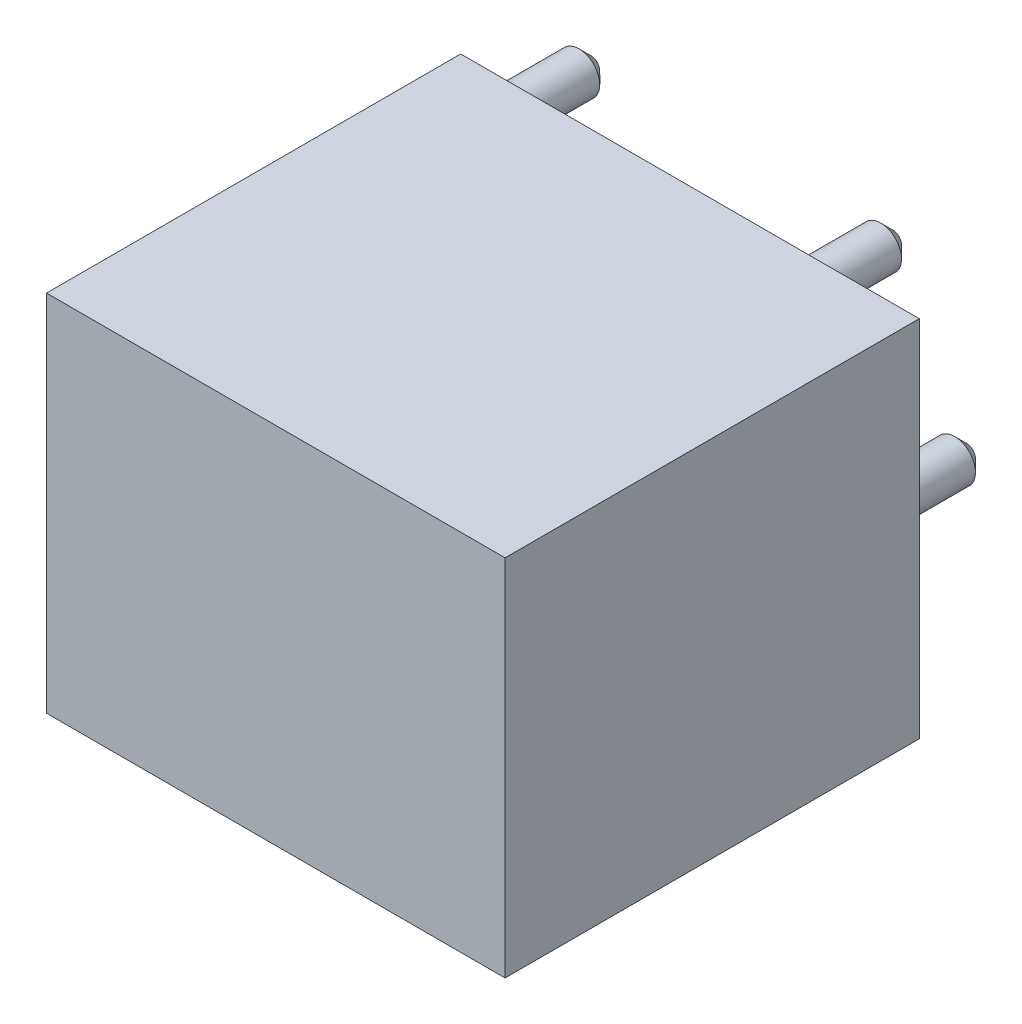
ISO-10303-21;
HEADER;
FILE_DESCRIPTION(('STEP AP214'),'2;1');
FILE_NAME('part.step','',(''),(''),'','','');
FILE_SCHEMA(('AUTOMOTIVE_DESIGN { 1 0 10303 214 1 1 1 1 }'));
ENDSEC;
DATA;
#1=APPLICATION_CONTEXT('core data for automotive mechanical design processes');
#2=APPLICATION_PROTOCOL_DEFINITION('international standard','automotive_design',2000,#1);
#3=PRODUCT_CONTEXT('',#1,'mechanical');
#4=PRODUCT('Part','Part','',(#3));
#5=PRODUCT_RELATED_PRODUCT_CATEGORY('part','',(#4));
#6=PRODUCT_DEFINITION_FORMATION('','',#4);
#7=PRODUCT_DEFINITION_CONTEXT('part definition',#1,'design');
#8=PRODUCT_DEFINITION('design','',#6,#7);
#9=PRODUCT_DEFINITION_SHAPE('','',#8);
#10=(LENGTH_UNIT() NAMED_UNIT(*) SI_UNIT(.MILLI.,.METRE.));
#11=(NAMED_UNIT(*) PLANE_ANGLE_UNIT() SI_UNIT($,.RADIAN.));
#12=(NAMED_UNIT(*) SI_UNIT($,.STERADIAN.) SOLID_ANGLE_UNIT());
#13=UNCERTAINTY_MEASURE_WITH_UNIT(LENGTH_MEASURE(1.E-05),#10,'distance_accuracy_value','');
#14=(GEOMETRIC_REPRESENTATION_CONTEXT(3) GLOBAL_UNCERTAINTY_ASSIGNED_CONTEXT((#13)) GLOBAL_UNIT_ASSIGNED_CONTEXT((#10,
#11,#12)) REPRESENTATION_CONTEXT('',''));
#15=CARTESIAN_POINT('',(0.,0.,0.));
#16=DIRECTION('',(0.,0.,1.));
#17=DIRECTION('',(1.,0.,0.));
#18=AXIS2_PLACEMENT_3D('',#15,#16,#17);
#19=CARTESIAN_POINT('',(-7.75,6.15,7.));
#20=DIRECTION('',(1.,0.,0.));
#21=DIRECTION('',(0.,1.,0.));
#22=AXIS2_PLACEMENT_3D('',#19,#20,#21);
#23=PLANE('',#22);
#24=DIRECTION('',(0.,-1.,0.));
#25=VECTOR('',#24,1.);
#26=CARTESIAN_POINT('',(-7.75,6.15,-7.));
#27=LINE('',#26,#25);
#28=CARTESIAN_POINT('',(-7.75,6.15,-7.));
#29=VERTEX_POINT('',#28);
#30=CARTESIAN_POINT('',(-7.75,-6.15,-7.));
#31=VERTEX_POINT('',#30);
#32=EDGE_CURVE('E101',#29,#31,#27,.T.);
#33=ORIENTED_EDGE('',*,*,#32,.T.);
#34=DIRECTION('',(0.,0.,-1.));
#35=VECTOR('',#34,1.);
#36=CARTESIAN_POINT('',(-7.75,-6.15,7.));
#37=LINE('',#36,#35);
#38=CARTESIAN_POINT('',(-7.75,-6.15,7.));
#39=VERTEX_POINT('',#38);
#40=EDGE_CURVE('E92',#39,#31,#37,.T.);
#41=ORIENTED_EDGE('',*,*,#40,.F.);
#42=DIRECTION('',(0.,-1.,0.));
#43=VECTOR('',#42,1.);
#44=CARTESIAN_POINT('',(-7.75,6.15,7.));
#45=LINE('',#44,#43);
#46=CARTESIAN_POINT('',(-7.75,6.15,7.));
#47=VERTEX_POINT('',#46);
#48=EDGE_CURVE('E86',#47,#39,#45,.T.);
#49=ORIENTED_EDGE('',*,*,#48,.F.);
#50=DIRECTION('',(0.,0.,-1.));
#51=VECTOR('',#50,1.);
#52=CARTESIAN_POINT('',(-7.75,6.15,7.));
#53=LINE('',#52,#51);
#54=EDGE_CURVE('E97',#47,#29,#53,.T.);
#55=ORIENTED_EDGE('',*,*,#54,.T.);
#56=EDGE_LOOP('',(#33,#41,#49,#55));
#57=FACE_BOUND('',#56,.T.);
#58=ADVANCED_FACE('F33',(#57),#23,.F.);
#59=CARTESIAN_POINT('',(-7.75,-6.15,7.));
#60=DIRECTION('',(0.,1.,0.));
#61=DIRECTION('',(0.,0.,1.));
#62=AXIS2_PLACEMENT_3D('',#59,#60,#61);
#63=PLANE('',#62);
#64=DIRECTION('',(1.,0.,0.));
#65=VECTOR('',#64,1.);
#66=CARTESIAN_POINT('',(-7.75,-6.15,-7.));
#67=LINE('',#66,#65);
#68=CARTESIAN_POINT('',(7.75,-6.15,-7.));
#69=VERTEX_POINT('',#68);
#70=EDGE_CURVE('E91',#31,#69,#67,.T.);
#71=ORIENTED_EDGE('',*,*,#70,.T.);
#72=DIRECTION('',(0.,0.,-1.));
#73=VECTOR('',#72,1.);
#74=CARTESIAN_POINT('',(7.75,-6.15,7.));
#75=LINE('',#74,#73);
#76=CARTESIAN_POINT('',(7.75,-6.15,7.));
#77=VERTEX_POINT('',#76);
#78=EDGE_CURVE('E89',#77,#69,#75,.T.);
#79=ORIENTED_EDGE('',*,*,#78,.F.);
#80=DIRECTION('',(1.,0.,0.));
#81=VECTOR('',#80,1.);
#82=CARTESIAN_POINT('',(-7.75,-6.15,7.));
#83=LINE('',#82,#81);
#84=EDGE_CURVE('E81',#39,#77,#83,.T.);
#85=ORIENTED_EDGE('',*,*,#84,.F.);
#86=ORIENTED_EDGE('',*,*,#40,.T.);
#87=EDGE_LOOP('',(#71,#79,#85,#86));
#88=FACE_BOUND('',#87,.T.);
#89=ADVANCED_FACE('F90',(#88),#63,.F.);
#90=CARTESIAN_POINT('',(7.75,6.15,7.));
#91=DIRECTION('',(-1.,0.,0.));
#92=DIRECTION('',(0.,-1.,0.));
#93=AXIS2_PLACEMENT_3D('',#90,#91,#92);
#94=PLANE('',#93);
#95=DIRECTION('',(0.,1.,0.));
#96=VECTOR('',#95,1.);
#97=CARTESIAN_POINT('',(7.75,6.15,-7.));
#98=LINE('',#97,#96);
#99=CARTESIAN_POINT('',(7.75,6.15,-7.));
#100=VERTEX_POINT('',#99);
#101=EDGE_CURVE('E67',#69,#100,#98,.T.);
#102=ORIENTED_EDGE('',*,*,#101,.T.);
#103=DIRECTION('',(0.,0.,-1.));
#104=VECTOR('',#103,1.);
#105=CARTESIAN_POINT('',(7.75,6.15,7.));
#106=LINE('',#105,#104);
#107=CARTESIAN_POINT('',(7.75,6.15,7.));
#108=VERTEX_POINT('',#107);
#109=EDGE_CURVE('E93',#108,#100,#106,.T.);
#110=ORIENTED_EDGE('',*,*,#109,.F.);
#111=DIRECTION('',(0.,1.,0.));
#112=VECTOR('',#111,1.);
#113=CARTESIAN_POINT('',(7.75,6.15,7.));
#114=LINE('',#113,#112);
#115=EDGE_CURVE('E84',#77,#108,#114,.T.);
#116=ORIENTED_EDGE('',*,*,#115,.F.);
#117=ORIENTED_EDGE('',*,*,#78,.T.);
#118=EDGE_LOOP('',(#102,#110,#116,#117));
#119=FACE_BOUND('',#118,.T.);
#120=ADVANCED_FACE('F95',(#119),#94,.F.);
#121=CARTESIAN_POINT('',(-7.75,6.15,7.));
#122=DIRECTION('',(0.,-1.,0.));
#123=DIRECTION('',(0.,0.,-1.));
#124=AXIS2_PLACEMENT_3D('',#121,#122,#123);
#125=PLANE('',#124);
#126=DIRECTION('',(-1.,0.,0.));
#127=VECTOR('',#126,1.);
#128=CARTESIAN_POINT('',(-7.75,6.15,-7.));
#129=LINE('',#128,#127);
#130=EDGE_CURVE('E73',#100,#29,#129,.T.);
#131=ORIENTED_EDGE('',*,*,#130,.T.);
#132=ORIENTED_EDGE('',*,*,#54,.F.);
#133=DIRECTION('',(-1.,0.,0.));
#134=VECTOR('',#133,1.);
#135=CARTESIAN_POINT('',(-7.75,6.15,7.));
#136=LINE('',#135,#134);
#137=EDGE_CURVE('E50',#108,#47,#136,.T.);
#138=ORIENTED_EDGE('',*,*,#137,.F.);
#139=ORIENTED_EDGE('',*,*,#109,.T.);
#140=EDGE_LOOP('',(#131,#132,#138,#139));
#141=FACE_BOUND('',#140,.T.);
#142=ADVANCED_FACE('F207',(#141),#125,.F.);
#143=CARTESIAN_POINT('',(0.,0.,7.));
#144=DIRECTION('',(0.,0.,1.));
#145=DIRECTION('',(1.,0.,0.));
#146=AXIS2_PLACEMENT_3D('',#143,#144,#145);
#147=PLANE('',#146);
#148=ORIENTED_EDGE('',*,*,#48,.T.);
#149=ORIENTED_EDGE('',*,*,#84,.T.);
#150=ORIENTED_EDGE('',*,*,#115,.T.);
#151=ORIENTED_EDGE('',*,*,#137,.T.);
#152=EDGE_LOOP('',(#148,#149,#150,#151));
#153=FACE_BOUND('',#152,.T.);
#154=ADVANCED_FACE('F82',(#153),#147,.T.);
#155=CARTESIAN_POINT('',(0.,0.,-7.));
#156=DIRECTION('',(0.,0.,1.));
#157=DIRECTION('',(1.,0.,0.));
#158=AXIS2_PLACEMENT_3D('',#155,#156,#157);
#159=PLANE('',#158);
#160=CARTESIAN_POINT('',(6.35,0.,-7.));
#161=DIRECTION('',(0.,0.,1.));
#162=DIRECTION('',(1.,0.,0.));
#163=AXIS2_PLACEMENT_3D('',#160,#161,#162);
#164=CIRCLE('',#163,0.7);
#165=CARTESIAN_POINT('',(7.05,0.,-7.));
#166=VERTEX_POINT('',#165);
#167=EDGE_CURVE('E122',#166,#166,#164,.F.);
#168=ORIENTED_EDGE('',*,*,#167,.F.);
#169=EDGE_LOOP('',(#168));
#170=FACE_BOUND('',#169,.T.);
#171=CARTESIAN_POINT('',(3.85,-5.,-7.));
#172=DIRECTION('',(0.,0.,1.));
#173=DIRECTION('',(1.,0.,0.));
#174=AXIS2_PLACEMENT_3D('',#171,#172,#173);
#175=CIRCLE('',#174,0.7);
#176=CARTESIAN_POINT('',(4.55,-5.,-7.));
#177=VERTEX_POINT('',#176);
#178=EDGE_CURVE('E119',#177,#177,#175,.F.);
#179=ORIENTED_EDGE('',*,*,#178,.F.);
#180=EDGE_LOOP('',(#179));
#181=FACE_BOUND('',#180,.T.);
#182=CARTESIAN_POINT('',(-6.35,-5.,-7.));
#183=DIRECTION('',(0.,0.,1.));
#184=DIRECTION('',(1.,0.,0.));
#185=AXIS2_PLACEMENT_3D('',#182,#183,#184);
#186=CIRCLE('',#185,0.700000000000001);
#187=CARTESIAN_POINT('',(-5.65,-5.,-7.));
#188=VERTEX_POINT('',#187);
#189=EDGE_CURVE('E116',#188,#188,#186,.F.);
#190=ORIENTED_EDGE('',*,*,#189,.F.);
#191=EDGE_LOOP('',(#190));
#192=FACE_BOUND('',#191,.T.);
#193=CARTESIAN_POINT('',(-6.35,5.,-7.));
#194=DIRECTION('',(0.,0.,1.));
#195=DIRECTION('',(1.,0.,0.));
#196=AXIS2_PLACEMENT_3D('',#193,#194,#195);
#197=CIRCLE('',#196,0.700000000000001);
#198=CARTESIAN_POINT('',(-5.65,5.,-7.));
#199=VERTEX_POINT('',#198);
#200=EDGE_CURVE('E113',#199,#199,#197,.F.);
#201=ORIENTED_EDGE('',*,*,#200,.F.);
#202=EDGE_LOOP('',(#201));
#203=FACE_BOUND('',#202,.T.);
#204=CARTESIAN_POINT('',(3.85,5.,-7.));
#205=DIRECTION('',(0.,0.,1.));
#206=DIRECTION('',(1.,0.,0.));
#207=AXIS2_PLACEMENT_3D('',#204,#205,#206);
#208=CIRCLE('',#207,0.7);
#209=CARTESIAN_POINT('',(4.55,5.,-7.));
#210=VERTEX_POINT('',#209);
#211=EDGE_CURVE('E110',#210,#210,#208,.F.);
#212=ORIENTED_EDGE('',*,*,#211,.F.);
#213=EDGE_LOOP('',(#212));
#214=FACE_BOUND('',#213,.T.);
#215=ORIENTED_EDGE('',*,*,#32,.F.);
#216=ORIENTED_EDGE('',*,*,#130,.F.);
#217=ORIENTED_EDGE('',*,*,#101,.F.);
#218=ORIENTED_EDGE('',*,*,#70,.F.);
#219=EDGE_LOOP('',(#215,#216,#217,#218));
#220=FACE_BOUND('',#219,.T.);
#221=ADVANCED_FACE('F200',(#170,#181,#192,#203,#214,#220),#159,.F.);
#222=CARTESIAN_POINT('',(3.85,5.,-10.));
#223=DIRECTION('',(0.,0.,1.));
#224=DIRECTION('',(1.,0.,0.));
#225=AXIS2_PLACEMENT_3D('',#222,#223,#224);
#226=CYLINDRICAL_SURFACE('',#225,0.7);
#227=CARTESIAN_POINT('',(3.85,5.,-9.59999999999999));
#228=DIRECTION('',(0.,0.,-1.));
#229=DIRECTION('',(-1.,0.,0.));
#230=AXIS2_PLACEMENT_3D('',#227,#228,#229);
#231=CIRCLE('',#230,0.7);
#232=CARTESIAN_POINT('',(3.15,5.,-9.59999999999999));
#233=VERTEX_POINT('',#232);
#234=EDGE_CURVE('E140',#233,#233,#231,.F.);
#235=ORIENTED_EDGE('',*,*,#234,.T.);
#236=EDGE_LOOP('',(#235));
#237=FACE_BOUND('',#236,.T.);
#238=ORIENTED_EDGE('',*,*,#211,.T.);
#239=EDGE_LOOP('',(#238));
#240=FACE_BOUND('',#239,.T.);
#241=ADVANCED_FACE('F191',(#237,#240),#226,.T.);
#242=CARTESIAN_POINT('',(3.85,5.,-10.));
#243=DIRECTION('',(0.,0.,-1.));
#244=DIRECTION('',(-1.,0.,0.));
#245=AXIS2_PLACEMENT_3D('',#242,#243,#244);
#246=PLANE('',#245);
#247=CARTESIAN_POINT('',(3.85,5.,-10.));
#248=DIRECTION('',(0.,0.,-1.));
#249=DIRECTION('',(-1.,0.,0.));
#250=AXIS2_PLACEMENT_3D('',#247,#248,#249);
#251=CIRCLE('',#250,0.299999999999995);
#252=CARTESIAN_POINT('',(3.55,5.,-10.));
#253=VERTEX_POINT('',#252);
#254=EDGE_CURVE('E137',#253,#253,#251,.T.);
#255=ORIENTED_EDGE('',*,*,#254,.T.);
#256=EDGE_LOOP('',(#255));
#257=FACE_BOUND('',#256,.T.);
#258=ADVANCED_FACE('F188',(#257),#246,.T.);
#259=CARTESIAN_POINT('',(-6.35,5.,-10.));
#260=DIRECTION('',(0.,0.,1.));
#261=DIRECTION('',(1.,0.,0.));
#262=AXIS2_PLACEMENT_3D('',#259,#260,#261);
#263=CYLINDRICAL_SURFACE('',#262,0.700000000000001);
#264=CARTESIAN_POINT('',(-6.35,5.,-9.6));
#265=DIRECTION('',(0.,0.,-1.));
#266=DIRECTION('',(-1.,0.,0.));
#267=AXIS2_PLACEMENT_3D('',#264,#265,#266);
#268=CIRCLE('',#267,0.700000000000001);
#269=CARTESIAN_POINT('',(-7.05,5.,-9.6));
#270=VERTEX_POINT('',#269);
#271=EDGE_CURVE('E128',#270,#270,#268,.F.);
#272=ORIENTED_EDGE('',*,*,#271,.T.);
#273=EDGE_LOOP('',(#272));
#274=FACE_BOUND('',#273,.T.);
#275=ORIENTED_EDGE('',*,*,#200,.T.);
#276=EDGE_LOOP('',(#275));
#277=FACE_BOUND('',#276,.T.);
#278=ADVANCED_FACE('F190',(#274,#277),#263,.T.);
#279=CARTESIAN_POINT('',(-6.35,5.,-10.));
#280=DIRECTION('',(0.,0.,-1.));
#281=DIRECTION('',(-1.,0.,0.));
#282=AXIS2_PLACEMENT_3D('',#279,#280,#281);
#283=PLANE('',#282);
#284=CARTESIAN_POINT('',(-6.35,5.,-10.));
#285=DIRECTION('',(0.,0.,-1.));
#286=DIRECTION('',(-1.,0.,0.));
#287=AXIS2_PLACEMENT_3D('',#284,#285,#286);
#288=CIRCLE('',#287,0.300000000000004);
#289=CARTESIAN_POINT('',(-6.65,5.,-10.));
#290=VERTEX_POINT('',#289);
#291=EDGE_CURVE('E125',#290,#290,#288,.T.);
#292=ORIENTED_EDGE('',*,*,#291,.T.);
#293=EDGE_LOOP('',(#292));
#294=FACE_BOUND('',#293,.T.);
#295=ADVANCED_FACE('F197',(#294),#283,.T.);
#296=CARTESIAN_POINT('',(-6.35,-5.,-10.));
#297=DIRECTION('',(0.,0.,1.));
#298=DIRECTION('',(1.,0.,0.));
#299=AXIS2_PLACEMENT_3D('',#296,#297,#298);
#300=CYLINDRICAL_SURFACE('',#299,0.700000000000001);
#301=CARTESIAN_POINT('',(-6.35,-5.,-9.6));
#302=DIRECTION('',(0.,0.,-1.));
#303=DIRECTION('',(-1.,0.,0.));
#304=AXIS2_PLACEMENT_3D('',#301,#302,#303);
#305=CIRCLE('',#304,0.700000000000001);
#306=CARTESIAN_POINT('',(-7.05,-5.,-9.6));
#307=VERTEX_POINT('',#306);
#308=EDGE_CURVE('E134',#307,#307,#305,.F.);
#309=ORIENTED_EDGE('',*,*,#308,.T.);
#310=EDGE_LOOP('',(#309));
#311=FACE_BOUND('',#310,.T.);
#312=ORIENTED_EDGE('',*,*,#189,.T.);
#313=EDGE_LOOP('',(#312));
#314=FACE_BOUND('',#313,.T.);
#315=ADVANCED_FACE('F252',(#311,#314),#300,.T.);
#316=CARTESIAN_POINT('',(-6.35,-5.,-10.));
#317=DIRECTION('',(0.,0.,-1.));
#318=DIRECTION('',(-1.,0.,0.));
#319=AXIS2_PLACEMENT_3D('',#316,#317,#318);
#320=PLANE('',#319);
#321=CARTESIAN_POINT('',(-6.35,-5.,-10.));
#322=DIRECTION('',(0.,0.,-1.));
#323=DIRECTION('',(-1.,0.,0.));
#324=AXIS2_PLACEMENT_3D('',#321,#322,#323);
#325=CIRCLE('',#324,0.300000000000004);
#326=CARTESIAN_POINT('',(-6.65,-5.,-10.));
#327=VERTEX_POINT('',#326);
#328=EDGE_CURVE('E131',#327,#327,#325,.T.);
#329=ORIENTED_EDGE('',*,*,#328,.T.);
#330=EDGE_LOOP('',(#329));
#331=FACE_BOUND('',#330,.T.);
#332=ADVANCED_FACE('F261',(#331),#320,.T.);
#333=CARTESIAN_POINT('',(3.85,-5.,-10.));
#334=DIRECTION('',(0.,0.,1.));
#335=DIRECTION('',(1.,0.,0.));
#336=AXIS2_PLACEMENT_3D('',#333,#334,#335);
#337=CYLINDRICAL_SURFACE('',#336,0.7);
#338=CARTESIAN_POINT('',(3.85,-5.,-9.59999999999999));
#339=DIRECTION('',(0.,0.,-1.));
#340=DIRECTION('',(-1.,0.,0.));
#341=AXIS2_PLACEMENT_3D('',#338,#339,#340);
#342=CIRCLE('',#341,0.7);
#343=CARTESIAN_POINT('',(3.15,-5.,-9.59999999999999));
#344=VERTEX_POINT('',#343);
#345=EDGE_CURVE('E11',#344,#344,#342,.F.);
#346=ORIENTED_EDGE('',*,*,#345,.T.);
#347=EDGE_LOOP('',(#346));
#348=FACE_BOUND('',#347,.T.);
#349=ORIENTED_EDGE('',*,*,#178,.T.);
#350=EDGE_LOOP('',(#349));
#351=FACE_BOUND('',#350,.T.);
#352=ADVANCED_FACE('F271',(#348,#351),#337,.T.);
#353=CARTESIAN_POINT('',(3.85,-5.,-10.));
#354=DIRECTION('',(0.,0.,-1.));
#355=DIRECTION('',(-1.,0.,0.));
#356=AXIS2_PLACEMENT_3D('',#353,#354,#355);
#357=PLANE('',#356);
#358=CARTESIAN_POINT('',(3.85,-5.,-10.));
#359=DIRECTION('',(0.,0.,-1.));
#360=DIRECTION('',(-1.,0.,0.));
#361=AXIS2_PLACEMENT_3D('',#358,#359,#360);
#362=CIRCLE('',#361,0.299999999999995);
#363=CARTESIAN_POINT('',(3.55,-5.,-10.));
#364=VERTEX_POINT('',#363);
#365=EDGE_CURVE('E42',#364,#364,#362,.T.);
#366=ORIENTED_EDGE('',*,*,#365,.T.);
#367=EDGE_LOOP('',(#366));
#368=FACE_BOUND('',#367,.T.);
#369=ADVANCED_FACE('F151',(#368),#357,.T.);
#370=CARTESIAN_POINT('',(6.35,0.,-10.));
#371=DIRECTION('',(0.,0.,1.));
#372=DIRECTION('',(1.,0.,0.));
#373=AXIS2_PLACEMENT_3D('',#370,#371,#372);
#374=CYLINDRICAL_SURFACE('',#373,0.7);
#375=CARTESIAN_POINT('',(6.35,0.,-9.6));
#376=DIRECTION('',(0.,0.,-1.));
#377=DIRECTION('',(-1.,0.,0.));
#378=AXIS2_PLACEMENT_3D('',#375,#376,#377);
#379=CIRCLE('',#378,0.7);
#380=CARTESIAN_POINT('',(5.65,0.,-9.6));
#381=VERTEX_POINT('',#380);
#382=EDGE_CURVE('E146',#381,#381,#379,.F.);
#383=ORIENTED_EDGE('',*,*,#382,.T.);
#384=EDGE_LOOP('',(#383));
#385=FACE_BOUND('',#384,.T.);
#386=ORIENTED_EDGE('',*,*,#167,.T.);
#387=EDGE_LOOP('',(#386));
#388=FACE_BOUND('',#387,.T.);
#389=ADVANCED_FACE('F290',(#385,#388),#374,.T.);
#390=CARTESIAN_POINT('',(6.35,0.,-10.));
#391=DIRECTION('',(0.,0.,-1.));
#392=DIRECTION('',(-1.,0.,0.));
#393=AXIS2_PLACEMENT_3D('',#390,#391,#392);
#394=PLANE('',#393);
#395=CARTESIAN_POINT('',(6.35,0.,-10.));
#396=DIRECTION('',(0.,0.,-1.));
#397=DIRECTION('',(-1.,0.,0.));
#398=AXIS2_PLACEMENT_3D('',#395,#396,#397);
#399=CIRCLE('',#398,0.299999999999995);
#400=CARTESIAN_POINT('',(6.05000000000001,0.,-10.));
#401=VERTEX_POINT('',#400);
#402=EDGE_CURVE('E143',#401,#401,#399,.T.);
#403=ORIENTED_EDGE('',*,*,#402,.T.);
#404=EDGE_LOOP('',(#403));
#405=FACE_BOUND('',#404,.T.);
#406=ADVANCED_FACE('F175',(#405),#394,.T.);
#407=CARTESIAN_POINT('',(-6.35,5.,-10.));
#408=DIRECTION('',(0.,0.,1.));
#409=DIRECTION('',(1.,0.,0.));
#410=AXIS2_PLACEMENT_3D('',#407,#408,#409);
#411=CONICAL_SURFACE('',#410,0.300000000000004,0.785398163397449);
#412=ORIENTED_EDGE('',*,*,#271,.F.);
#413=EDGE_LOOP('',(#412));
#414=FACE_BOUND('',#413,.T.);
#415=ORIENTED_EDGE('',*,*,#291,.F.);
#416=EDGE_LOOP('',(#415));
#417=FACE_BOUND('',#416,.T.);
#418=ADVANCED_FACE('F171',(#414,#417),#411,.T.);
#419=CARTESIAN_POINT('',(-6.35,-5.,-10.));
#420=DIRECTION('',(0.,0.,1.));
#421=DIRECTION('',(1.,0.,0.));
#422=AXIS2_PLACEMENT_3D('',#419,#420,#421);
#423=CONICAL_SURFACE('',#422,0.300000000000004,0.785398163397449);
#424=ORIENTED_EDGE('',*,*,#308,.F.);
#425=EDGE_LOOP('',(#424));
#426=FACE_BOUND('',#425,.T.);
#427=ORIENTED_EDGE('',*,*,#328,.F.);
#428=EDGE_LOOP('',(#427));
#429=FACE_BOUND('',#428,.T.);
#430=ADVANCED_FACE('F174',(#426,#429),#423,.T.);
#431=CARTESIAN_POINT('',(3.85,5.,-10.));
#432=DIRECTION('',(0.,0.,1.));
#433=DIRECTION('',(1.,0.,0.));
#434=AXIS2_PLACEMENT_3D('',#431,#432,#433);
#435=CONICAL_SURFACE('',#434,0.299999999999995,0.785398163397447);
#436=ORIENTED_EDGE('',*,*,#234,.F.);
#437=EDGE_LOOP('',(#436));
#438=FACE_BOUND('',#437,.T.);
#439=ORIENTED_EDGE('',*,*,#254,.F.);
#440=EDGE_LOOP('',(#439));
#441=FACE_BOUND('',#440,.T.);
#442=ADVANCED_FACE('F159',(#438,#441),#435,.T.);
#443=CARTESIAN_POINT('',(6.35,0.,-10.));
#444=DIRECTION('',(0.,0.,1.));
#445=DIRECTION('',(1.,0.,0.));
#446=AXIS2_PLACEMENT_3D('',#443,#444,#445);
#447=CONICAL_SURFACE('',#446,0.299999999999995,0.785398163397449);
#448=ORIENTED_EDGE('',*,*,#382,.F.);
#449=EDGE_LOOP('',(#448));
#450=FACE_BOUND('',#449,.T.);
#451=ORIENTED_EDGE('',*,*,#402,.F.);
#452=EDGE_LOOP('',(#451));
#453=FACE_BOUND('',#452,.T.);
#454=ADVANCED_FACE('F154',(#450,#453),#447,.T.);
#455=CARTESIAN_POINT('',(3.85,-5.,-10.));
#456=DIRECTION('',(0.,0.,1.));
#457=DIRECTION('',(1.,0.,0.));
#458=AXIS2_PLACEMENT_3D('',#455,#456,#457);
#459=CONICAL_SURFACE('',#458,0.299999999999995,0.785398163397447);
#460=ORIENTED_EDGE('',*,*,#345,.F.);
#461=EDGE_LOOP('',(#460));
#462=FACE_BOUND('',#461,.T.);
#463=ORIENTED_EDGE('',*,*,#365,.F.);
#464=EDGE_LOOP('',(#463));
#465=FACE_BOUND('',#464,.T.);
#466=ADVANCED_FACE('F35',(#462,#465),#459,.T.);
#467=CLOSED_SHELL('',(#58,#89,#120,#142,#154,#221,#241,#258,#278,#295,#315,#332,#352,#369,#389,
#406,#418,#430,#442,#454,#466));
#468=MANIFOLD_SOLID_BREP('B2',#467);
#469=ADVANCED_BREP_SHAPE_REPRESENTATION('',(#18,#468),#14);
#470=SHAPE_DEFINITION_REPRESENTATION(#9,#469);
ENDSEC;
END-ISO-10303-21;
